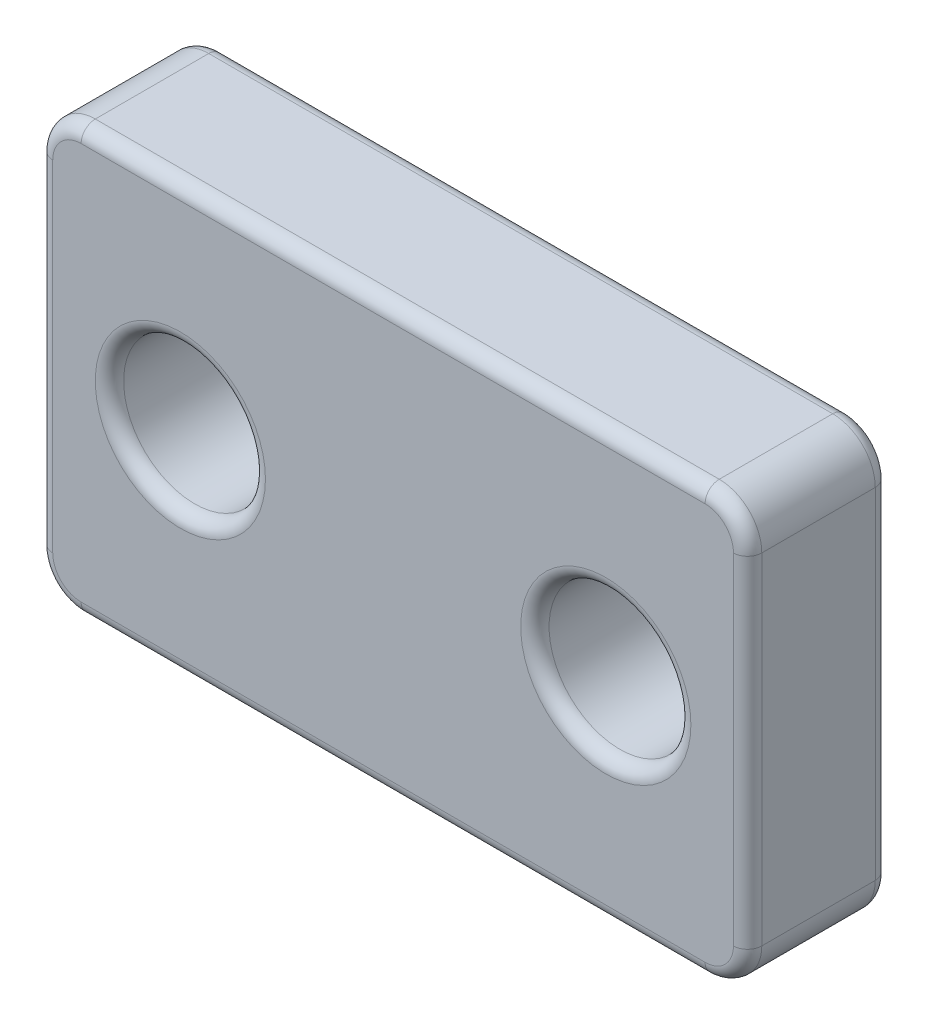
ISO-10303-21;
HEADER;
FILE_DESCRIPTION(('STEP AP214'),'2;1');
FILE_NAME('part.step','',(''),(''),'','','');
FILE_SCHEMA(('AUTOMOTIVE_DESIGN { 1 0 10303 214 1 1 1 1 }'));
ENDSEC;
DATA;
#1=APPLICATION_CONTEXT('core data for automotive mechanical design processes');
#2=APPLICATION_PROTOCOL_DEFINITION('international standard','automotive_design',2000,#1);
#3=PRODUCT_CONTEXT('',#1,'mechanical');
#4=PRODUCT('Part','Part','',(#3));
#5=PRODUCT_RELATED_PRODUCT_CATEGORY('part','',(#4));
#6=PRODUCT_DEFINITION_FORMATION('','',#4);
#7=PRODUCT_DEFINITION_CONTEXT('part definition',#1,'design');
#8=PRODUCT_DEFINITION('design','',#6,#7);
#9=PRODUCT_DEFINITION_SHAPE('','',#8);
#10=(LENGTH_UNIT() NAMED_UNIT(*) SI_UNIT(.MILLI.,.METRE.));
#11=(NAMED_UNIT(*) PLANE_ANGLE_UNIT() SI_UNIT($,.RADIAN.));
#12=(NAMED_UNIT(*) SI_UNIT($,.STERADIAN.) SOLID_ANGLE_UNIT());
#13=UNCERTAINTY_MEASURE_WITH_UNIT(LENGTH_MEASURE(1.E-05),#10,'distance_accuracy_value','');
#14=(GEOMETRIC_REPRESENTATION_CONTEXT(3) GLOBAL_UNCERTAINTY_ASSIGNED_CONTEXT((#13)) GLOBAL_UNIT_ASSIGNED_CONTEXT((#10,
#11,#12)) REPRESENTATION_CONTEXT('',''));
#15=CARTESIAN_POINT('',(0.,0.,0.));
#16=DIRECTION('',(0.,0.,1.));
#17=DIRECTION('',(1.,0.,0.));
#18=AXIS2_PLACEMENT_3D('',#15,#16,#17);
#19=CARTESIAN_POINT('',(-25.,-15.,10.));
#20=DIRECTION('',(1.,0.,0.));
#21=DIRECTION('',(0.,0.,-1.));
#22=AXIS2_PLACEMENT_3D('',#19,#20,#21);
#23=PLANE('',#22);
#24=DIRECTION('',(0.,0.,-1.));
#25=VECTOR('',#24,1.);
#26=CARTESIAN_POINT('',(-25.,-12.,10.));
#27=LINE('',#26,#25);
#28=CARTESIAN_POINT('',(-25.,-12.,0.999999999999999));
#29=VERTEX_POINT('',#28);
#30=CARTESIAN_POINT('',(-25.,-12.,9.));
#31=VERTEX_POINT('',#30);
#32=EDGE_CURVE('E376',#29,#31,#27,.F.);
#33=ORIENTED_EDGE('',*,*,#32,.T.);
#34=DIRECTION('',(0.,-1.,0.));
#35=VECTOR('',#34,1.);
#36=CARTESIAN_POINT('',(-25.,12.,9.));
#37=LINE('',#36,#35);
#38=CARTESIAN_POINT('',(-25.,12.,9.));
#39=VERTEX_POINT('',#38);
#40=EDGE_CURVE('E294',#31,#39,#37,.F.);
#41=ORIENTED_EDGE('',*,*,#40,.T.);
#42=DIRECTION('',(0.,0.,-1.));
#43=VECTOR('',#42,1.);
#44=CARTESIAN_POINT('',(-25.,12.,10.));
#45=LINE('',#44,#43);
#46=CARTESIAN_POINT('',(-25.,12.,0.999999999999999));
#47=VERTEX_POINT('',#46);
#48=EDGE_CURVE('E384',#39,#47,#45,.T.);
#49=ORIENTED_EDGE('',*,*,#48,.T.);
#50=DIRECTION('',(0.,-1.,0.));
#51=VECTOR('',#50,1.);
#52=CARTESIAN_POINT('',(-25.,-15.,0.999999999999999));
#53=LINE('',#52,#51);
#54=EDGE_CURVE('E291',#47,#29,#53,.T.);
#55=ORIENTED_EDGE('',*,*,#54,.T.);
#56=EDGE_LOOP('',(#33,#41,#49,#55));
#57=FACE_BOUND('',#56,.T.);
#58=ADVANCED_FACE('F41',(#57),#23,.F.);
#59=CARTESIAN_POINT('',(25.,-15.,10.));
#60=DIRECTION('',(0.,1.,0.));
#61=DIRECTION('',(-1.,0.,0.));
#62=AXIS2_PLACEMENT_3D('',#59,#60,#61);
#63=PLANE('',#62);
#64=DIRECTION('',(0.,0.,-1.));
#65=VECTOR('',#64,1.);
#66=CARTESIAN_POINT('',(-22.,-15.,10.));
#67=LINE('',#66,#65);
#68=CARTESIAN_POINT('',(-22.,-15.,9.));
#69=VERTEX_POINT('',#68);
#70=CARTESIAN_POINT('',(-22.,-15.,0.999999999999999));
#71=VERTEX_POINT('',#70);
#72=EDGE_CURVE('E378',#69,#71,#67,.T.);
#73=ORIENTED_EDGE('',*,*,#72,.T.);
#74=DIRECTION('',(1.,0.,0.));
#75=VECTOR('',#74,1.);
#76=CARTESIAN_POINT('',(25.,-15.,0.999999999999999));
#77=LINE('',#76,#75);
#78=CARTESIAN_POINT('',(22.,-15.,0.999999999999999));
#79=VERTEX_POINT('',#78);
#80=EDGE_CURVE('E253',#71,#79,#77,.T.);
#81=ORIENTED_EDGE('',*,*,#80,.T.);
#82=DIRECTION('',(0.,0.,-1.));
#83=VECTOR('',#82,1.);
#84=CARTESIAN_POINT('',(22.,-15.,10.));
#85=LINE('',#84,#83);
#86=CARTESIAN_POINT('',(22.,-15.,9.));
#87=VERTEX_POINT('',#86);
#88=EDGE_CURVE('E330',#79,#87,#85,.F.);
#89=ORIENTED_EDGE('',*,*,#88,.T.);
#90=DIRECTION('',(1.,0.,0.));
#91=VECTOR('',#90,1.);
#92=CARTESIAN_POINT('',(-22.,-15.,9.));
#93=LINE('',#92,#91);
#94=EDGE_CURVE('E250',#87,#69,#93,.F.);
#95=ORIENTED_EDGE('',*,*,#94,.T.);
#96=EDGE_LOOP('',(#73,#81,#89,#95));
#97=FACE_BOUND('',#96,.T.);
#98=ADVANCED_FACE('F456',(#97),#63,.F.);
#99=CARTESIAN_POINT('',(25.,-15.,10.));
#100=DIRECTION('',(-1.,0.,0.));
#101=DIRECTION('',(0.,0.,1.));
#102=AXIS2_PLACEMENT_3D('',#99,#100,#101);
#103=PLANE('',#102);
#104=DIRECTION('',(0.,0.,-1.));
#105=VECTOR('',#104,1.);
#106=CARTESIAN_POINT('',(25.,-12.,10.));
#107=LINE('',#106,#105);
#108=CARTESIAN_POINT('',(25.,-12.,9.));
#109=VERTEX_POINT('',#108);
#110=CARTESIAN_POINT('',(25.,-12.,0.999999999999999));
#111=VERTEX_POINT('',#110);
#112=EDGE_CURVE('E389',#109,#111,#107,.T.);
#113=ORIENTED_EDGE('',*,*,#112,.T.);
#114=DIRECTION('',(0.,1.,0.));
#115=VECTOR('',#114,1.);
#116=CARTESIAN_POINT('',(25.,-15.,0.999999999999999));
#117=LINE('',#116,#115);
#118=CARTESIAN_POINT('',(25.,12.,0.999999999999999));
#119=VERTEX_POINT('',#118);
#120=EDGE_CURVE('E241',#111,#119,#117,.T.);
#121=ORIENTED_EDGE('',*,*,#120,.T.);
#122=DIRECTION('',(0.,0.,-1.));
#123=VECTOR('',#122,1.);
#124=CARTESIAN_POINT('',(25.,12.,10.));
#125=LINE('',#124,#123);
#126=CARTESIAN_POINT('',(25.,12.,9.));
#127=VERTEX_POINT('',#126);
#128=EDGE_CURVE('E383',#119,#127,#125,.F.);
#129=ORIENTED_EDGE('',*,*,#128,.T.);
#130=DIRECTION('',(0.,1.,0.));
#131=VECTOR('',#130,1.);
#132=CARTESIAN_POINT('',(25.,-12.,9.));
#133=LINE('',#132,#131);
#134=EDGE_CURVE('E238',#127,#109,#133,.F.);
#135=ORIENTED_EDGE('',*,*,#134,.T.);
#136=EDGE_LOOP('',(#113,#121,#129,#135));
#137=FACE_BOUND('',#136,.T.);
#138=ADVANCED_FACE('F438',(#137),#103,.F.);
#139=CARTESIAN_POINT('',(25.,15.,10.));
#140=DIRECTION('',(0.,-1.,0.));
#141=DIRECTION('',(1.,0.,0.));
#142=AXIS2_PLACEMENT_3D('',#139,#140,#141);
#143=PLANE('',#142);
#144=DIRECTION('',(0.,0.,-1.));
#145=VECTOR('',#144,1.);
#146=CARTESIAN_POINT('',(22.,15.,10.));
#147=LINE('',#146,#145);
#148=CARTESIAN_POINT('',(22.,15.,9.));
#149=VERTEX_POINT('',#148);
#150=CARTESIAN_POINT('',(22.,15.,0.999999999999999));
#151=VERTEX_POINT('',#150);
#152=EDGE_CURVE('E189',#149,#151,#147,.T.);
#153=ORIENTED_EDGE('',*,*,#152,.T.);
#154=DIRECTION('',(-1.,0.,0.));
#155=VECTOR('',#154,1.);
#156=CARTESIAN_POINT('',(25.,15.,0.999999999999999));
#157=LINE('',#156,#155);
#158=CARTESIAN_POINT('',(-22.,15.,0.999999999999999));
#159=VERTEX_POINT('',#158);
#160=EDGE_CURVE('E228',#151,#159,#157,.T.);
#161=ORIENTED_EDGE('',*,*,#160,.T.);
#162=DIRECTION('',(0.,0.,-1.));
#163=VECTOR('',#162,1.);
#164=CARTESIAN_POINT('',(-22.,15.,10.));
#165=LINE('',#164,#163);
#166=CARTESIAN_POINT('',(-22.,15.,9.));
#167=VERTEX_POINT('',#166);
#168=EDGE_CURVE('E185',#159,#167,#165,.F.);
#169=ORIENTED_EDGE('',*,*,#168,.T.);
#170=DIRECTION('',(-1.,0.,0.));
#171=VECTOR('',#170,1.);
#172=CARTESIAN_POINT('',(22.,15.,9.));
#173=LINE('',#172,#171);
#174=EDGE_CURVE('E225',#167,#149,#173,.F.);
#175=ORIENTED_EDGE('',*,*,#174,.T.);
#176=EDGE_LOOP('',(#153,#161,#169,#175));
#177=FACE_BOUND('',#176,.T.);
#178=ADVANCED_FACE('F401',(#177),#143,.F.);
#179=CARTESIAN_POINT('',(0.,0.,10.));
#180=DIRECTION('',(0.,0.,1.));
#181=DIRECTION('',(1.,0.,0.));
#182=AXIS2_PLACEMENT_3D('',#179,#180,#181);
#183=PLANE('',#182);
#184=CARTESIAN_POINT('',(15.,0.,10.));
#185=DIRECTION('',(0.,0.,1.));
#186=DIRECTION('',(1.,0.,0.));
#187=AXIS2_PLACEMENT_3D('',#184,#185,#186);
#188=CIRCLE('',#187,6.);
#189=CARTESIAN_POINT('',(21.,0.,10.));
#190=VERTEX_POINT('',#189);
#191=EDGE_CURVE('E287',#190,#190,#188,.F.);
#192=ORIENTED_EDGE('',*,*,#191,.T.);
#193=EDGE_LOOP('',(#192));
#194=FACE_BOUND('',#193,.T.);
#195=CARTESIAN_POINT('',(-15.,0.,10.));
#196=DIRECTION('',(0.,0.,1.));
#197=DIRECTION('',(1.,0.,0.));
#198=AXIS2_PLACEMENT_3D('',#195,#196,#197);
#199=CIRCLE('',#198,6.);
#200=CARTESIAN_POINT('',(-9.,0.,10.));
#201=VERTEX_POINT('',#200);
#202=EDGE_CURVE('E283',#201,#201,#199,.F.);
#203=ORIENTED_EDGE('',*,*,#202,.T.);
#204=EDGE_LOOP('',(#203));
#205=FACE_BOUND('',#204,.T.);
#206=DIRECTION('',(0.,1.,0.));
#207=VECTOR('',#206,1.);
#208=CARTESIAN_POINT('',(24.,12.,10.));
#209=LINE('',#208,#207);
#210=CARTESIAN_POINT('',(24.,-12.,10.));
#211=VERTEX_POINT('',#210);
#212=CARTESIAN_POINT('',(24.,12.,10.));
#213=VERTEX_POINT('',#212);
#214=EDGE_CURVE('E59',#211,#213,#209,.T.);
#215=ORIENTED_EDGE('',*,*,#214,.T.);
#216=CARTESIAN_POINT('',(22.,12.,10.));
#217=DIRECTION('',(0.,0.,1.));
#218=DIRECTION('',(1.,0.,0.));
#219=AXIS2_PLACEMENT_3D('',#216,#217,#218);
#220=CIRCLE('',#219,2.);
#221=CARTESIAN_POINT('',(22.,14.,10.));
#222=VERTEX_POINT('',#221);
#223=EDGE_CURVE('E280',#213,#222,#220,.T.);
#224=ORIENTED_EDGE('',*,*,#223,.T.);
#225=DIRECTION('',(-1.,0.,0.));
#226=VECTOR('',#225,1.);
#227=CARTESIAN_POINT('',(-22.,14.,10.));
#228=LINE('',#227,#226);
#229=CARTESIAN_POINT('',(-22.,14.,10.));
#230=VERTEX_POINT('',#229);
#231=EDGE_CURVE('E261',#222,#230,#228,.T.);
#232=ORIENTED_EDGE('',*,*,#231,.T.);
#233=CARTESIAN_POINT('',(-22.,12.,10.));
#234=DIRECTION('',(0.,0.,1.));
#235=DIRECTION('',(1.,0.,0.));
#236=AXIS2_PLACEMENT_3D('',#233,#234,#235);
#237=CIRCLE('',#236,2.);
#238=CARTESIAN_POINT('',(-24.,12.,10.));
#239=VERTEX_POINT('',#238);
#240=EDGE_CURVE('E264',#230,#239,#237,.T.);
#241=ORIENTED_EDGE('',*,*,#240,.T.);
#242=DIRECTION('',(0.,-1.,0.));
#243=VECTOR('',#242,1.);
#244=CARTESIAN_POINT('',(-24.,-12.,10.));
#245=LINE('',#244,#243);
#246=CARTESIAN_POINT('',(-24.,-12.,10.));
#247=VERTEX_POINT('',#246);
#248=EDGE_CURVE('E267',#239,#247,#245,.T.);
#249=ORIENTED_EDGE('',*,*,#248,.T.);
#250=CARTESIAN_POINT('',(-22.,-12.,10.));
#251=DIRECTION('',(0.,0.,1.));
#252=DIRECTION('',(1.,0.,0.));
#253=AXIS2_PLACEMENT_3D('',#250,#251,#252);
#254=CIRCLE('',#253,2.);
#255=CARTESIAN_POINT('',(-22.,-14.,10.));
#256=VERTEX_POINT('',#255);
#257=EDGE_CURVE('E270',#247,#256,#254,.T.);
#258=ORIENTED_EDGE('',*,*,#257,.T.);
#259=DIRECTION('',(1.,0.,0.));
#260=VECTOR('',#259,1.);
#261=CARTESIAN_POINT('',(22.,-14.,10.));
#262=LINE('',#261,#260);
#263=CARTESIAN_POINT('',(22.,-14.,10.));
#264=VERTEX_POINT('',#263);
#265=EDGE_CURVE('E273',#256,#264,#262,.T.);
#266=ORIENTED_EDGE('',*,*,#265,.T.);
#267=CARTESIAN_POINT('',(22.,-12.,10.));
#268=DIRECTION('',(0.,0.,1.));
#269=DIRECTION('',(1.,0.,0.));
#270=AXIS2_PLACEMENT_3D('',#267,#268,#269);
#271=CIRCLE('',#270,2.);
#272=EDGE_CURVE('E64',#264,#211,#271,.T.);
#273=ORIENTED_EDGE('',*,*,#272,.T.);
#274=EDGE_LOOP('',(#215,#224,#232,#241,#249,#258,#266,#273));
#275=FACE_BOUND('',#274,.T.);
#276=ADVANCED_FACE('F545',(#194,#205,#275),#183,.T.);
#277=CARTESIAN_POINT('',(0.,0.,0.));
#278=DIRECTION('',(0.,0.,1.));
#279=DIRECTION('',(1.,0.,0.));
#280=AXIS2_PLACEMENT_3D('',#277,#278,#279);
#281=PLANE('',#280);
#282=CARTESIAN_POINT('',(15.,0.,0.));
#283=DIRECTION('',(0.,0.,1.));
#284=DIRECTION('',(1.,0.,0.));
#285=AXIS2_PLACEMENT_3D('',#282,#283,#284);
#286=CIRCLE('',#285,6.);
#287=CARTESIAN_POINT('',(21.,0.,0.));
#288=VERTEX_POINT('',#287);
#289=EDGE_CURVE('E214',#288,#288,#286,.T.);
#290=ORIENTED_EDGE('',*,*,#289,.T.);
#291=EDGE_LOOP('',(#290));
#292=FACE_BOUND('',#291,.T.);
#293=CARTESIAN_POINT('',(-15.,0.,0.));
#294=DIRECTION('',(0.,0.,1.));
#295=DIRECTION('',(1.,0.,0.));
#296=AXIS2_PLACEMENT_3D('',#293,#294,#295);
#297=CIRCLE('',#296,6.);
#298=CARTESIAN_POINT('',(-9.,0.,0.));
#299=VERTEX_POINT('',#298);
#300=EDGE_CURVE('E210',#299,#299,#297,.T.);
#301=ORIENTED_EDGE('',*,*,#300,.T.);
#302=EDGE_LOOP('',(#301));
#303=FACE_BOUND('',#302,.T.);
#304=DIRECTION('',(0.,-1.,0.));
#305=VECTOR('',#304,1.);
#306=CARTESIAN_POINT('',(-24.,0.,0.));
#307=LINE('',#306,#305);
#308=CARTESIAN_POINT('',(-24.,-12.,0.));
#309=VERTEX_POINT('',#308);
#310=CARTESIAN_POINT('',(-24.,12.,0.));
#311=VERTEX_POINT('',#310);
#312=EDGE_CURVE('E161',#309,#311,#307,.F.);
#313=ORIENTED_EDGE('',*,*,#312,.T.);
#314=CARTESIAN_POINT('',(-22.,12.,0.));
#315=DIRECTION('',(0.,0.,1.));
#316=DIRECTION('',(1.,0.,0.));
#317=AXIS2_PLACEMENT_3D('',#314,#315,#316);
#318=CIRCLE('',#317,2.);
#319=CARTESIAN_POINT('',(-22.,14.,0.));
#320=VERTEX_POINT('',#319);
#321=EDGE_CURVE('E207',#311,#320,#318,.F.);
#322=ORIENTED_EDGE('',*,*,#321,.T.);
#323=DIRECTION('',(-1.,0.,0.));
#324=VECTOR('',#323,1.);
#325=CARTESIAN_POINT('',(0.,14.,0.));
#326=LINE('',#325,#324);
#327=CARTESIAN_POINT('',(22.,14.,0.));
#328=VERTEX_POINT('',#327);
#329=EDGE_CURVE('E204',#320,#328,#326,.F.);
#330=ORIENTED_EDGE('',*,*,#329,.T.);
#331=CARTESIAN_POINT('',(22.,12.,0.));
#332=DIRECTION('',(0.,0.,1.));
#333=DIRECTION('',(1.,0.,0.));
#334=AXIS2_PLACEMENT_3D('',#331,#332,#333);
#335=CIRCLE('',#334,2.);
#336=CARTESIAN_POINT('',(24.,12.,0.));
#337=VERTEX_POINT('',#336);
#338=EDGE_CURVE('E201',#328,#337,#335,.F.);
#339=ORIENTED_EDGE('',*,*,#338,.T.);
#340=DIRECTION('',(0.,1.,0.));
#341=VECTOR('',#340,1.);
#342=CARTESIAN_POINT('',(24.,0.,0.));
#343=LINE('',#342,#341);
#344=CARTESIAN_POINT('',(24.,-12.,0.));
#345=VERTEX_POINT('',#344);
#346=EDGE_CURVE('E198',#337,#345,#343,.F.);
#347=ORIENTED_EDGE('',*,*,#346,.T.);
#348=CARTESIAN_POINT('',(22.,-12.,0.));
#349=DIRECTION('',(0.,0.,1.));
#350=DIRECTION('',(1.,0.,0.));
#351=AXIS2_PLACEMENT_3D('',#348,#349,#350);
#352=CIRCLE('',#351,2.);
#353=CARTESIAN_POINT('',(22.,-14.,0.));
#354=VERTEX_POINT('',#353);
#355=EDGE_CURVE('E195',#345,#354,#352,.F.);
#356=ORIENTED_EDGE('',*,*,#355,.T.);
#357=DIRECTION('',(1.,0.,0.));
#358=VECTOR('',#357,1.);
#359=CARTESIAN_POINT('',(0.,-14.,0.));
#360=LINE('',#359,#358);
#361=CARTESIAN_POINT('',(-22.,-14.,0.));
#362=VERTEX_POINT('',#361);
#363=EDGE_CURVE('E164',#354,#362,#360,.F.);
#364=ORIENTED_EDGE('',*,*,#363,.T.);
#365=CARTESIAN_POINT('',(-22.,-12.,0.));
#366=DIRECTION('',(0.,0.,1.));
#367=DIRECTION('',(1.,0.,0.));
#368=AXIS2_PLACEMENT_3D('',#365,#366,#367);
#369=CIRCLE('',#368,2.);
#370=EDGE_CURVE('E156',#362,#309,#369,.F.);
#371=ORIENTED_EDGE('',*,*,#370,.T.);
#372=EDGE_LOOP('',(#313,#322,#330,#339,#347,#356,#364,#371));
#373=FACE_BOUND('',#372,.T.);
#374=ADVANCED_FACE('F158',(#292,#303,#373),#281,.F.);
#375=CARTESIAN_POINT('',(15.,0.,0.));
#376=DIRECTION('',(0.,0.,1.));
#377=DIRECTION('',(1.,0.,0.));
#378=AXIS2_PLACEMENT_3D('',#375,#376,#377);
#379=CYLINDRICAL_SURFACE('',#378,5.);
#380=CARTESIAN_POINT('',(15.,0.,9.));
#381=DIRECTION('',(0.,0.,1.));
#382=DIRECTION('',(1.,0.,0.));
#383=AXIS2_PLACEMENT_3D('',#380,#381,#382);
#384=CIRCLE('',#383,5.);
#385=CARTESIAN_POINT('',(20.,0.,9.));
#386=VERTEX_POINT('',#385);
#387=EDGE_CURVE('E301',#386,#386,#384,.T.);
#388=ORIENTED_EDGE('',*,*,#387,.T.);
#389=EDGE_LOOP('',(#388));
#390=FACE_BOUND('',#389,.T.);
#391=CARTESIAN_POINT('',(15.,0.,1.));
#392=DIRECTION('',(0.,0.,1.));
#393=DIRECTION('',(1.,0.,0.));
#394=AXIS2_PLACEMENT_3D('',#391,#392,#393);
#395=CIRCLE('',#394,5.);
#396=CARTESIAN_POINT('',(20.,0.,1.));
#397=VERTEX_POINT('',#396);
#398=EDGE_CURVE('E297',#397,#397,#395,.F.);
#399=ORIENTED_EDGE('',*,*,#398,.T.);
#400=EDGE_LOOP('',(#399));
#401=FACE_BOUND('',#400,.T.);
#402=ADVANCED_FACE('F538',(#390,#401),#379,.F.);
#403=CARTESIAN_POINT('',(-15.,0.,0.));
#404=DIRECTION('',(0.,0.,1.));
#405=DIRECTION('',(1.,0.,0.));
#406=AXIS2_PLACEMENT_3D('',#403,#404,#405);
#407=CYLINDRICAL_SURFACE('',#406,5.);
#408=CARTESIAN_POINT('',(-15.,0.,9.));
#409=DIRECTION('',(0.,0.,1.));
#410=DIRECTION('',(1.,0.,0.));
#411=AXIS2_PLACEMENT_3D('',#408,#409,#410);
#412=CIRCLE('',#411,5.);
#413=CARTESIAN_POINT('',(-10.,0.,9.));
#414=VERTEX_POINT('',#413);
#415=EDGE_CURVE('E11',#414,#414,#412,.T.);
#416=ORIENTED_EDGE('',*,*,#415,.T.);
#417=EDGE_LOOP('',(#416));
#418=FACE_BOUND('',#417,.T.);
#419=CARTESIAN_POINT('',(-15.,0.,1.));
#420=DIRECTION('',(0.,0.,1.));
#421=DIRECTION('',(1.,0.,0.));
#422=AXIS2_PLACEMENT_3D('',#419,#420,#421);
#423=CIRCLE('',#422,5.);
#424=CARTESIAN_POINT('',(-10.,0.,1.));
#425=VERTEX_POINT('',#424);
#426=EDGE_CURVE('E51',#425,#425,#423,.F.);
#427=ORIENTED_EDGE('',*,*,#426,.T.);
#428=EDGE_LOOP('',(#427));
#429=FACE_BOUND('',#428,.T.);
#430=ADVANCED_FACE('F485',(#418,#429),#407,.F.);
#431=CARTESIAN_POINT('',(-22.,-12.,10.));
#432=DIRECTION('',(0.,0.,-1.));
#433=DIRECTION('',(-1.,0.,0.));
#434=AXIS2_PLACEMENT_3D('',#431,#432,#433);
#435=CYLINDRICAL_SURFACE('',#434,3.);
#436=ORIENTED_EDGE('',*,*,#32,.F.);
#437=CARTESIAN_POINT('',(-22.,-12.,0.999999999999999));
#438=DIRECTION('',(0.,0.,1.));
#439=DIRECTION('',(1.,0.,0.));
#440=AXIS2_PLACEMENT_3D('',#437,#438,#439);
#441=CIRCLE('',#440,3.);
#442=EDGE_CURVE('E174',#29,#71,#441,.T.);
#443=ORIENTED_EDGE('',*,*,#442,.T.);
#444=ORIENTED_EDGE('',*,*,#72,.F.);
#445=CARTESIAN_POINT('',(-22.,-12.,9.));
#446=DIRECTION('',(0.,0.,1.));
#447=DIRECTION('',(1.,0.,0.));
#448=AXIS2_PLACEMENT_3D('',#445,#446,#447);
#449=CIRCLE('',#448,3.);
#450=EDGE_CURVE('E256',#69,#31,#449,.F.);
#451=ORIENTED_EDGE('',*,*,#450,.T.);
#452=EDGE_LOOP('',(#436,#443,#444,#451));
#453=FACE_BOUND('',#452,.T.);
#454=ADVANCED_FACE('F375',(#453),#435,.T.);
#455=CARTESIAN_POINT('',(22.,-12.,10.));
#456=DIRECTION('',(0.,0.,-1.));
#457=DIRECTION('',(-1.,0.,0.));
#458=AXIS2_PLACEMENT_3D('',#455,#456,#457);
#459=CYLINDRICAL_SURFACE('',#458,3.);
#460=ORIENTED_EDGE('',*,*,#88,.F.);
#461=CARTESIAN_POINT('',(22.,-12.,0.999999999999999));
#462=DIRECTION('',(0.,0.,1.));
#463=DIRECTION('',(1.,0.,0.));
#464=AXIS2_PLACEMENT_3D('',#461,#462,#463);
#465=CIRCLE('',#464,3.);
#466=EDGE_CURVE('E247',#79,#111,#465,.T.);
#467=ORIENTED_EDGE('',*,*,#466,.T.);
#468=ORIENTED_EDGE('',*,*,#112,.F.);
#469=CARTESIAN_POINT('',(22.,-12.,9.));
#470=DIRECTION('',(0.,0.,1.));
#471=DIRECTION('',(1.,0.,0.));
#472=AXIS2_PLACEMENT_3D('',#469,#470,#471);
#473=CIRCLE('',#472,3.);
#474=EDGE_CURVE('E244',#109,#87,#473,.F.);
#475=ORIENTED_EDGE('',*,*,#474,.T.);
#476=EDGE_LOOP('',(#460,#467,#468,#475));
#477=FACE_BOUND('',#476,.T.);
#478=ADVANCED_FACE('F458',(#477),#459,.T.);
#479=CARTESIAN_POINT('',(-22.,12.,10.));
#480=DIRECTION('',(0.,0.,-1.));
#481=DIRECTION('',(-1.,0.,0.));
#482=AXIS2_PLACEMENT_3D('',#479,#480,#481);
#483=CYLINDRICAL_SURFACE('',#482,3.);
#484=ORIENTED_EDGE('',*,*,#168,.F.);
#485=CARTESIAN_POINT('',(-22.,12.,0.999999999999999));
#486=DIRECTION('',(0.,0.,1.));
#487=DIRECTION('',(1.,0.,0.));
#488=AXIS2_PLACEMENT_3D('',#485,#486,#487);
#489=CIRCLE('',#488,3.);
#490=EDGE_CURVE('E221',#159,#47,#489,.T.);
#491=ORIENTED_EDGE('',*,*,#490,.T.);
#492=ORIENTED_EDGE('',*,*,#48,.F.);
#493=CARTESIAN_POINT('',(-22.,12.,9.));
#494=DIRECTION('',(0.,0.,1.));
#495=DIRECTION('',(1.,0.,0.));
#496=AXIS2_PLACEMENT_3D('',#493,#494,#495);
#497=CIRCLE('',#496,3.);
#498=EDGE_CURVE('E218',#39,#167,#497,.F.);
#499=ORIENTED_EDGE('',*,*,#498,.T.);
#500=EDGE_LOOP('',(#484,#491,#492,#499));
#501=FACE_BOUND('',#500,.T.);
#502=ADVANCED_FACE('F419',(#501),#483,.T.);
#503=CARTESIAN_POINT('',(22.,12.,10.));
#504=DIRECTION('',(0.,0.,-1.));
#505=DIRECTION('',(-1.,0.,0.));
#506=AXIS2_PLACEMENT_3D('',#503,#504,#505);
#507=CYLINDRICAL_SURFACE('',#506,3.);
#508=ORIENTED_EDGE('',*,*,#128,.F.);
#509=CARTESIAN_POINT('',(22.,12.,0.999999999999999));
#510=DIRECTION('',(0.,0.,1.));
#511=DIRECTION('',(1.,0.,0.));
#512=AXIS2_PLACEMENT_3D('',#509,#510,#511);
#513=CIRCLE('',#512,3.);
#514=EDGE_CURVE('E235',#119,#151,#513,.T.);
#515=ORIENTED_EDGE('',*,*,#514,.T.);
#516=ORIENTED_EDGE('',*,*,#152,.F.);
#517=CARTESIAN_POINT('',(22.,12.,9.));
#518=DIRECTION('',(0.,0.,1.));
#519=DIRECTION('',(1.,0.,0.));
#520=AXIS2_PLACEMENT_3D('',#517,#518,#519);
#521=CIRCLE('',#520,3.);
#522=EDGE_CURVE('E231',#149,#127,#521,.F.);
#523=ORIENTED_EDGE('',*,*,#522,.T.);
#524=EDGE_LOOP('',(#508,#515,#516,#523));
#525=FACE_BOUND('',#524,.T.);
#526=ADVANCED_FACE('F435',(#525),#507,.T.);
#527=CARTESIAN_POINT('',(22.,-12.,0.999999999999999));
#528=DIRECTION('',(0.,0.,1.));
#529=DIRECTION('',(1.,0.,0.));
#530=AXIS2_PLACEMENT_3D('',#527,#528,#529);
#531=TOROIDAL_SURFACE('',#530,2.,1.);
#532=CARTESIAN_POINT('',(24.,-12.,0.999999999999999));
#533=DIRECTION('',(0.,1.,0.));
#534=DIRECTION('',(0.,0.,1.));
#535=AXIS2_PLACEMENT_3D('',#532,#533,#534);
#536=CIRCLE('',#535,1.);
#537=EDGE_CURVE('E322',#111,#345,#536,.T.);
#538=ORIENTED_EDGE('',*,*,#537,.F.);
#539=ORIENTED_EDGE('',*,*,#466,.F.);
#540=CARTESIAN_POINT('',(22.,-14.,1.));
#541=DIRECTION('',(-1.,0.,0.));
#542=DIRECTION('',(0.,0.,1.));
#543=AXIS2_PLACEMENT_3D('',#540,#541,#542);
#544=CIRCLE('',#543,1.);
#545=EDGE_CURVE('E326',#354,#79,#544,.T.);
#546=ORIENTED_EDGE('',*,*,#545,.F.);
#547=ORIENTED_EDGE('',*,*,#355,.F.);
#548=EDGE_LOOP('',(#538,#539,#546,#547));
#549=FACE_BOUND('',#548,.T.);
#550=ADVANCED_FACE('F448',(#549),#531,.T.);
#551=CARTESIAN_POINT('',(25.,-14.,0.999999999999999));
#552=DIRECTION('',(1.,0.,0.));
#553=DIRECTION('',(0.,1.,0.));
#554=AXIS2_PLACEMENT_3D('',#551,#552,#553);
#555=CYLINDRICAL_SURFACE('',#554,1.);
#556=ORIENTED_EDGE('',*,*,#545,.T.);
#557=ORIENTED_EDGE('',*,*,#80,.F.);
#558=CARTESIAN_POINT('',(-22.,-14.,1.));
#559=DIRECTION('',(-1.,0.,0.));
#560=DIRECTION('',(0.,0.,1.));
#561=AXIS2_PLACEMENT_3D('',#558,#559,#560);
#562=CIRCLE('',#561,1.);
#563=EDGE_CURVE('E319',#362,#71,#562,.T.);
#564=ORIENTED_EDGE('',*,*,#563,.F.);
#565=ORIENTED_EDGE('',*,*,#363,.F.);
#566=EDGE_LOOP('',(#556,#557,#564,#565));
#567=FACE_BOUND('',#566,.T.);
#568=ADVANCED_FACE('F452',(#567),#555,.T.);
#569=CARTESIAN_POINT('',(24.,-15.,0.999999999999999));
#570=DIRECTION('',(0.,1.,0.));
#571=DIRECTION('',(0.,0.,1.));
#572=AXIS2_PLACEMENT_3D('',#569,#570,#571);
#573=CYLINDRICAL_SURFACE('',#572,1.);
#574=ORIENTED_EDGE('',*,*,#537,.T.);
#575=ORIENTED_EDGE('',*,*,#346,.F.);
#576=CARTESIAN_POINT('',(24.,12.,0.999999999999999));
#577=DIRECTION('',(0.,1.,0.));
#578=DIRECTION('',(0.,0.,1.));
#579=AXIS2_PLACEMENT_3D('',#576,#577,#578);
#580=CIRCLE('',#579,1.);
#581=EDGE_CURVE('E178',#119,#337,#580,.T.);
#582=ORIENTED_EDGE('',*,*,#581,.F.);
#583=ORIENTED_EDGE('',*,*,#120,.F.);
#584=EDGE_LOOP('',(#574,#575,#582,#583));
#585=FACE_BOUND('',#584,.T.);
#586=ADVANCED_FACE('F443',(#585),#573,.T.);
#587=CARTESIAN_POINT('',(-22.,-12.,0.999999999999999));
#588=DIRECTION('',(0.,0.,1.));
#589=DIRECTION('',(1.,0.,0.));
#590=AXIS2_PLACEMENT_3D('',#587,#588,#589);
#591=TOROIDAL_SURFACE('',#590,2.,1.);
#592=ORIENTED_EDGE('',*,*,#563,.T.);
#593=ORIENTED_EDGE('',*,*,#442,.F.);
#594=CARTESIAN_POINT('',(-24.,-12.,1.));
#595=DIRECTION('',(0.,1.,0.));
#596=DIRECTION('',(0.,0.,1.));
#597=AXIS2_PLACEMENT_3D('',#594,#595,#596);
#598=CIRCLE('',#597,1.);
#599=EDGE_CURVE('E172',#309,#29,#598,.T.);
#600=ORIENTED_EDGE('',*,*,#599,.F.);
#601=ORIENTED_EDGE('',*,*,#370,.F.);
#602=EDGE_LOOP('',(#592,#593,#600,#601));
#603=FACE_BOUND('',#602,.T.);
#604=ADVANCED_FACE('F173',(#603),#591,.T.);
#605=CARTESIAN_POINT('',(22.,12.,0.999999999999999));
#606=DIRECTION('',(0.,0.,1.));
#607=DIRECTION('',(1.,0.,0.));
#608=AXIS2_PLACEMENT_3D('',#605,#606,#607);
#609=TOROIDAL_SURFACE('',#608,2.,1.);
#610=ORIENTED_EDGE('',*,*,#581,.T.);
#611=ORIENTED_EDGE('',*,*,#338,.F.);
#612=CARTESIAN_POINT('',(22.,14.,0.999999999999999));
#613=DIRECTION('',(-1.,0.,0.));
#614=DIRECTION('',(0.,0.,1.));
#615=AXIS2_PLACEMENT_3D('',#612,#613,#614);
#616=CIRCLE('',#615,1.);
#617=EDGE_CURVE('E179',#151,#328,#616,.T.);
#618=ORIENTED_EDGE('',*,*,#617,.F.);
#619=ORIENTED_EDGE('',*,*,#514,.F.);
#620=EDGE_LOOP('',(#610,#611,#618,#619));
#621=FACE_BOUND('',#620,.T.);
#622=ADVANCED_FACE('F410',(#621),#609,.T.);
#623=CARTESIAN_POINT('',(-24.,-15.,0.999999999999999));
#624=DIRECTION('',(0.,-1.,0.));
#625=DIRECTION('',(0.,0.,-1.));
#626=AXIS2_PLACEMENT_3D('',#623,#624,#625);
#627=CYLINDRICAL_SURFACE('',#626,1.);
#628=ORIENTED_EDGE('',*,*,#599,.T.);
#629=ORIENTED_EDGE('',*,*,#54,.F.);
#630=CARTESIAN_POINT('',(-24.,12.,1.));
#631=DIRECTION('',(0.,1.,0.));
#632=DIRECTION('',(0.,0.,1.));
#633=AXIS2_PLACEMENT_3D('',#630,#631,#632);
#634=CIRCLE('',#633,1.);
#635=EDGE_CURVE('E182',#311,#47,#634,.T.);
#636=ORIENTED_EDGE('',*,*,#635,.F.);
#637=ORIENTED_EDGE('',*,*,#312,.F.);
#638=EDGE_LOOP('',(#628,#629,#636,#637));
#639=FACE_BOUND('',#638,.T.);
#640=ADVANCED_FACE('F181',(#639),#627,.T.);
#641=CARTESIAN_POINT('',(25.,14.,0.999999999999999));
#642=DIRECTION('',(-1.,0.,0.));
#643=DIRECTION('',(0.,-1.,0.));
#644=AXIS2_PLACEMENT_3D('',#641,#642,#643);
#645=CYLINDRICAL_SURFACE('',#644,1.);
#646=ORIENTED_EDGE('',*,*,#617,.T.);
#647=ORIENTED_EDGE('',*,*,#329,.F.);
#648=CARTESIAN_POINT('',(-22.,14.,0.999999999999999));
#649=DIRECTION('',(-1.,0.,0.));
#650=DIRECTION('',(0.,0.,1.));
#651=AXIS2_PLACEMENT_3D('',#648,#649,#650);
#652=CIRCLE('',#651,1.);
#653=EDGE_CURVE('E308',#159,#320,#652,.T.);
#654=ORIENTED_EDGE('',*,*,#653,.F.);
#655=ORIENTED_EDGE('',*,*,#160,.F.);
#656=EDGE_LOOP('',(#646,#647,#654,#655));
#657=FACE_BOUND('',#656,.T.);
#658=ADVANCED_FACE('F414',(#657),#645,.T.);
#659=CARTESIAN_POINT('',(-22.,12.,0.999999999999999));
#660=DIRECTION('',(0.,0.,1.));
#661=DIRECTION('',(1.,0.,0.));
#662=AXIS2_PLACEMENT_3D('',#659,#660,#661);
#663=TOROIDAL_SURFACE('',#662,2.,1.);
#664=ORIENTED_EDGE('',*,*,#635,.T.);
#665=ORIENTED_EDGE('',*,*,#490,.F.);
#666=ORIENTED_EDGE('',*,*,#653,.T.);
#667=ORIENTED_EDGE('',*,*,#321,.F.);
#668=EDGE_LOOP('',(#664,#665,#666,#667));
#669=FACE_BOUND('',#668,.T.);
#670=ADVANCED_FACE('F417',(#669),#663,.T.);
#671=CARTESIAN_POINT('',(-22.,-12.,9.));
#672=DIRECTION('',(0.,0.,1.));
#673=DIRECTION('',(1.,0.,0.));
#674=AXIS2_PLACEMENT_3D('',#671,#672,#673);
#675=TOROIDAL_SURFACE('',#674,2.,1.);
#676=CARTESIAN_POINT('',(-24.,-12.,9.));
#677=DIRECTION('',(0.,1.,0.));
#678=DIRECTION('',(0.,0.,1.));
#679=AXIS2_PLACEMENT_3D('',#676,#677,#678);
#680=CIRCLE('',#679,1.);
#681=EDGE_CURVE('E352',#31,#247,#680,.T.);
#682=ORIENTED_EDGE('',*,*,#681,.F.);
#683=ORIENTED_EDGE('',*,*,#450,.F.);
#684=CARTESIAN_POINT('',(-22.,-14.,9.));
#685=DIRECTION('',(1.,0.,0.));
#686=DIRECTION('',(0.,0.,-1.));
#687=AXIS2_PLACEMENT_3D('',#684,#685,#686);
#688=CIRCLE('',#687,1.);
#689=EDGE_CURVE('E45',#256,#69,#688,.T.);
#690=ORIENTED_EDGE('',*,*,#689,.F.);
#691=ORIENTED_EDGE('',*,*,#257,.F.);
#692=EDGE_LOOP('',(#682,#683,#690,#691));
#693=FACE_BOUND('',#692,.T.);
#694=ADVANCED_FACE('F370',(#693),#675,.T.);
#695=CARTESIAN_POINT('',(0.,-14.,9.));
#696=DIRECTION('',(-1.,0.,0.));
#697=DIRECTION('',(0.,-1.,0.));
#698=AXIS2_PLACEMENT_3D('',#695,#696,#697);
#699=CYLINDRICAL_SURFACE('',#698,1.);
#700=ORIENTED_EDGE('',*,*,#689,.T.);
#701=ORIENTED_EDGE('',*,*,#94,.F.);
#702=CARTESIAN_POINT('',(22.,-14.,9.));
#703=DIRECTION('',(1.,0.,0.));
#704=DIRECTION('',(0.,0.,-1.));
#705=AXIS2_PLACEMENT_3D('',#702,#703,#704);
#706=CIRCLE('',#705,1.);
#707=EDGE_CURVE('E349',#264,#87,#706,.T.);
#708=ORIENTED_EDGE('',*,*,#707,.F.);
#709=ORIENTED_EDGE('',*,*,#265,.F.);
#710=EDGE_LOOP('',(#700,#701,#708,#709));
#711=FACE_BOUND('',#710,.T.);
#712=ADVANCED_FACE('F365',(#711),#699,.T.);
#713=CARTESIAN_POINT('',(-24.,0.,9.));
#714=DIRECTION('',(0.,1.,0.));
#715=DIRECTION('',(0.,0.,1.));
#716=AXIS2_PLACEMENT_3D('',#713,#714,#715);
#717=CYLINDRICAL_SURFACE('',#716,1.);
#718=ORIENTED_EDGE('',*,*,#681,.T.);
#719=ORIENTED_EDGE('',*,*,#248,.F.);
#720=CARTESIAN_POINT('',(-24.,12.,9.));
#721=DIRECTION('',(0.,1.,0.));
#722=DIRECTION('',(0.,0.,1.));
#723=AXIS2_PLACEMENT_3D('',#720,#721,#722);
#724=CIRCLE('',#723,1.);
#725=EDGE_CURVE('E345',#39,#239,#724,.T.);
#726=ORIENTED_EDGE('',*,*,#725,.F.);
#727=ORIENTED_EDGE('',*,*,#40,.F.);
#728=EDGE_LOOP('',(#718,#719,#726,#727));
#729=FACE_BOUND('',#728,.T.);
#730=ADVANCED_FACE('F680',(#729),#717,.T.);
#731=CARTESIAN_POINT('',(22.,-12.,9.));
#732=DIRECTION('',(0.,0.,1.));
#733=DIRECTION('',(1.,0.,0.));
#734=AXIS2_PLACEMENT_3D('',#731,#732,#733);
#735=TOROIDAL_SURFACE('',#734,2.,1.);
#736=ORIENTED_EDGE('',*,*,#707,.T.);
#737=ORIENTED_EDGE('',*,*,#474,.F.);
#738=CARTESIAN_POINT('',(24.,-12.,9.));
#739=DIRECTION('',(0.,1.,0.));
#740=DIRECTION('',(0.,0.,1.));
#741=AXIS2_PLACEMENT_3D('',#738,#739,#740);
#742=CIRCLE('',#741,1.);
#743=EDGE_CURVE('E341',#211,#109,#742,.T.);
#744=ORIENTED_EDGE('',*,*,#743,.F.);
#745=ORIENTED_EDGE('',*,*,#272,.F.);
#746=EDGE_LOOP('',(#736,#737,#744,#745));
#747=FACE_BOUND('',#746,.T.);
#748=ADVANCED_FACE('F464',(#747),#735,.T.);
#749=CARTESIAN_POINT('',(-22.,12.,9.));
#750=DIRECTION('',(0.,0.,1.));
#751=DIRECTION('',(1.,0.,0.));
#752=AXIS2_PLACEMENT_3D('',#749,#750,#751);
#753=TOROIDAL_SURFACE('',#752,2.,1.);
#754=ORIENTED_EDGE('',*,*,#725,.T.);
#755=ORIENTED_EDGE('',*,*,#240,.F.);
#756=CARTESIAN_POINT('',(-22.,14.,9.));
#757=DIRECTION('',(1.,0.,0.));
#758=DIRECTION('',(0.,0.,-1.));
#759=AXIS2_PLACEMENT_3D('',#756,#757,#758);
#760=CIRCLE('',#759,1.);
#761=EDGE_CURVE('E337',#167,#230,#760,.T.);
#762=ORIENTED_EDGE('',*,*,#761,.F.);
#763=ORIENTED_EDGE('',*,*,#498,.F.);
#764=EDGE_LOOP('',(#754,#755,#762,#763));
#765=FACE_BOUND('',#764,.T.);
#766=ADVANCED_FACE('F425',(#765),#753,.T.);
#767=CARTESIAN_POINT('',(24.,0.,9.));
#768=DIRECTION('',(0.,-1.,0.));
#769=DIRECTION('',(0.,0.,-1.));
#770=AXIS2_PLACEMENT_3D('',#767,#768,#769);
#771=CYLINDRICAL_SURFACE('',#770,1.);
#772=ORIENTED_EDGE('',*,*,#743,.T.);
#773=ORIENTED_EDGE('',*,*,#134,.F.);
#774=CARTESIAN_POINT('',(24.,12.,9.));
#775=DIRECTION('',(0.,1.,0.));
#776=DIRECTION('',(0.,0.,1.));
#777=AXIS2_PLACEMENT_3D('',#774,#775,#776);
#778=CIRCLE('',#777,1.);
#779=EDGE_CURVE('E334',#213,#127,#778,.T.);
#780=ORIENTED_EDGE('',*,*,#779,.F.);
#781=ORIENTED_EDGE('',*,*,#214,.F.);
#782=EDGE_LOOP('',(#772,#773,#780,#781));
#783=FACE_BOUND('',#782,.T.);
#784=ADVANCED_FACE('F466',(#783),#771,.T.);
#785=CARTESIAN_POINT('',(0.,14.,9.));
#786=DIRECTION('',(1.,0.,0.));
#787=DIRECTION('',(0.,1.,0.));
#788=AXIS2_PLACEMENT_3D('',#785,#786,#787);
#789=CYLINDRICAL_SURFACE('',#788,1.);
#790=ORIENTED_EDGE('',*,*,#761,.T.);
#791=ORIENTED_EDGE('',*,*,#231,.F.);
#792=CARTESIAN_POINT('',(22.,14.,9.));
#793=DIRECTION('',(1.,0.,0.));
#794=DIRECTION('',(0.,0.,-1.));
#795=AXIS2_PLACEMENT_3D('',#792,#793,#794);
#796=CIRCLE('',#795,1.);
#797=EDGE_CURVE('E331',#149,#222,#796,.T.);
#798=ORIENTED_EDGE('',*,*,#797,.F.);
#799=ORIENTED_EDGE('',*,*,#174,.F.);
#800=EDGE_LOOP('',(#790,#791,#798,#799));
#801=FACE_BOUND('',#800,.T.);
#802=ADVANCED_FACE('F429',(#801),#789,.T.);
#803=CARTESIAN_POINT('',(22.,12.,9.));
#804=DIRECTION('',(0.,0.,1.));
#805=DIRECTION('',(1.,0.,0.));
#806=AXIS2_PLACEMENT_3D('',#803,#804,#805);
#807=TOROIDAL_SURFACE('',#806,2.,1.);
#808=ORIENTED_EDGE('',*,*,#779,.T.);
#809=ORIENTED_EDGE('',*,*,#522,.F.);
#810=ORIENTED_EDGE('',*,*,#797,.T.);
#811=ORIENTED_EDGE('',*,*,#223,.F.);
#812=EDGE_LOOP('',(#808,#809,#810,#811));
#813=FACE_BOUND('',#812,.T.);
#814=ADVANCED_FACE('F432',(#813),#807,.T.);
#815=CARTESIAN_POINT('',(15.,0.,9.));
#816=DIRECTION('',(0.,0.,1.));
#817=DIRECTION('',(1.,0.,0.));
#818=AXIS2_PLACEMENT_3D('',#815,#816,#817);
#819=TOROIDAL_SURFACE('',#818,6.,1.);
#820=ORIENTED_EDGE('',*,*,#191,.F.);
#821=EDGE_LOOP('',(#820));
#822=FACE_BOUND('',#821,.T.);
#823=ORIENTED_EDGE('',*,*,#387,.F.);
#824=EDGE_LOOP('',(#823));
#825=FACE_BOUND('',#824,.T.);
#826=ADVANCED_FACE('F509',(#822,#825),#819,.T.);
#827=CARTESIAN_POINT('',(15.,0.,1.));
#828=DIRECTION('',(0.,0.,1.));
#829=DIRECTION('',(1.,0.,0.));
#830=AXIS2_PLACEMENT_3D('',#827,#828,#829);
#831=TOROIDAL_SURFACE('',#830,6.,1.);
#832=ORIENTED_EDGE('',*,*,#398,.F.);
#833=EDGE_LOOP('',(#832));
#834=FACE_BOUND('',#833,.T.);
#835=ORIENTED_EDGE('',*,*,#289,.F.);
#836=EDGE_LOOP('',(#835));
#837=FACE_BOUND('',#836,.T.);
#838=ADVANCED_FACE('F513',(#834,#837),#831,.T.);
#839=CARTESIAN_POINT('',(-15.,0.,9.));
#840=DIRECTION('',(0.,0.,1.));
#841=DIRECTION('',(1.,0.,0.));
#842=AXIS2_PLACEMENT_3D('',#839,#840,#841);
#843=TOROIDAL_SURFACE('',#842,6.,1.);
#844=ORIENTED_EDGE('',*,*,#202,.F.);
#845=EDGE_LOOP('',(#844));
#846=FACE_BOUND('',#845,.T.);
#847=ORIENTED_EDGE('',*,*,#415,.F.);
#848=EDGE_LOOP('',(#847));
#849=FACE_BOUND('',#848,.T.);
#850=ADVANCED_FACE('F519',(#846,#849),#843,.T.);
#851=CARTESIAN_POINT('',(-15.,0.,1.));
#852=DIRECTION('',(0.,0.,1.));
#853=DIRECTION('',(1.,0.,0.));
#854=AXIS2_PLACEMENT_3D('',#851,#852,#853);
#855=TOROIDAL_SURFACE('',#854,6.,1.);
#856=ORIENTED_EDGE('',*,*,#426,.F.);
#857=EDGE_LOOP('',(#856));
#858=FACE_BOUND('',#857,.T.);
#859=ORIENTED_EDGE('',*,*,#300,.F.);
#860=EDGE_LOOP('',(#859));
#861=FACE_BOUND('',#860,.T.);
#862=ADVANCED_FACE('F43',(#858,#861),#855,.T.);
#863=CLOSED_SHELL('',(#58,#98,#138,#178,#276,#374,#402,#430,#454,#478,#502,#526,#550,#568,#586,
#604,#622,#640,#658,#670,#694,#712,#730,#748,#766,#784,#802,#814,#826,#838,#850,#862));
#864=MANIFOLD_SOLID_BREP('B2',#863);
#865=ADVANCED_BREP_SHAPE_REPRESENTATION('',(#18,#864),#14);
#866=SHAPE_DEFINITION_REPRESENTATION(#9,#865);
ENDSEC;
END-ISO-10303-21;
